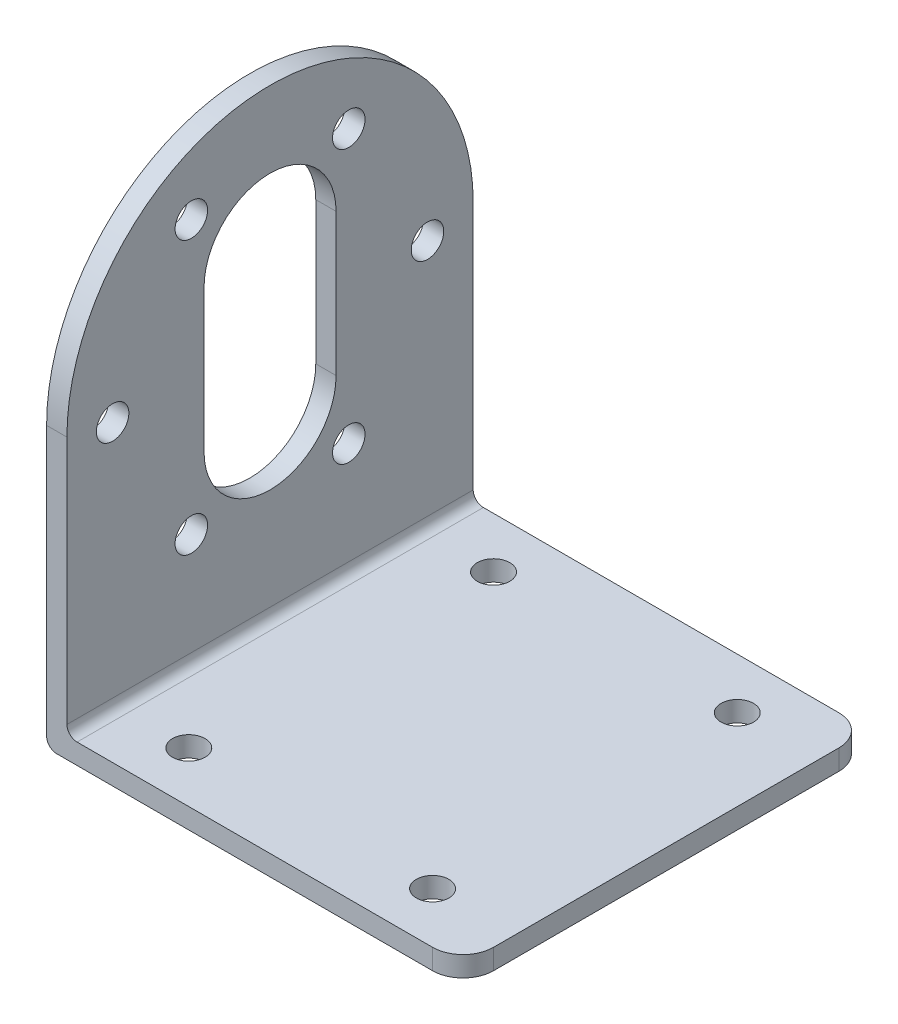
ISO-10303-21;
HEADER;
FILE_DESCRIPTION(('STEP AP214'),'2;1');
FILE_NAME('part.step','',(''),(''),'','','');
FILE_SCHEMA(('AUTOMOTIVE_DESIGN { 1 0 10303 214 1 1 1 1 }'));
ENDSEC;
DATA;
#1=APPLICATION_CONTEXT('core data for automotive mechanical design processes');
#2=APPLICATION_PROTOCOL_DEFINITION('international standard','automotive_design',2000,#1);
#3=PRODUCT_CONTEXT('',#1,'mechanical');
#4=PRODUCT('Part','Part','',(#3));
#5=PRODUCT_RELATED_PRODUCT_CATEGORY('part','',(#4));
#6=PRODUCT_DEFINITION_FORMATION('','',#4);
#7=PRODUCT_DEFINITION_CONTEXT('part definition',#1,'design');
#8=PRODUCT_DEFINITION('design','',#6,#7);
#9=PRODUCT_DEFINITION_SHAPE('','',#8);
#10=(LENGTH_UNIT() NAMED_UNIT(*) SI_UNIT(.MILLI.,.METRE.));
#11=(NAMED_UNIT(*) PLANE_ANGLE_UNIT() SI_UNIT($,.RADIAN.));
#12=(NAMED_UNIT(*) SI_UNIT($,.STERADIAN.) SOLID_ANGLE_UNIT());
#13=UNCERTAINTY_MEASURE_WITH_UNIT(LENGTH_MEASURE(1.E-05),#10,'distance_accuracy_value','');
#14=(GEOMETRIC_REPRESENTATION_CONTEXT(3) GLOBAL_UNCERTAINTY_ASSIGNED_CONTEXT((#13)) GLOBAL_UNIT_ASSIGNED_CONTEXT((#10,
#11,#12)) REPRESENTATION_CONTEXT('',''));
#15=CARTESIAN_POINT('',(0.,0.,0.));
#16=DIRECTION('',(0.,0.,1.));
#17=DIRECTION('',(1.,0.,0.));
#18=AXIS2_PLACEMENT_3D('',#15,#16,#17);
#19=CARTESIAN_POINT('',(2.,27.5,20.));
#20=DIRECTION('',(-1.,0.,0.));
#21=DIRECTION('',(0.,0.,1.));
#22=AXIS2_PLACEMENT_3D('',#19,#20,#21);
#23=CYLINDRICAL_SURFACE('',#22,20.);
#24=DIRECTION('',(-1.,0.,0.));
#25=VECTOR('',#24,1.);
#26=CARTESIAN_POINT('',(0.,27.5,40.));
#27=LINE('',#26,#25);
#28=CARTESIAN_POINT('',(2.,27.5,40.));
#29=VERTEX_POINT('',#28);
#30=CARTESIAN_POINT('',(0.,27.5,40.));
#31=VERTEX_POINT('',#30);
#32=EDGE_CURVE('E343',#29,#31,#27,.T.);
#33=ORIENTED_EDGE('',*,*,#32,.F.);
#34=CARTESIAN_POINT('',(2.,27.5,20.));
#35=DIRECTION('',(-1.,0.,0.));
#36=DIRECTION('',(0.,-1.,0.));
#37=AXIS2_PLACEMENT_3D('',#34,#35,#36);
#38=CIRCLE('',#37,20.);
#39=CARTESIAN_POINT('',(2.,27.5,0.));
#40=VERTEX_POINT('',#39);
#41=EDGE_CURVE('E106',#40,#29,#38,.F.);
#42=ORIENTED_EDGE('',*,*,#41,.F.);
#43=DIRECTION('',(1.,0.,0.));
#44=VECTOR('',#43,1.);
#45=CARTESIAN_POINT('',(2.,27.5,0.));
#46=LINE('',#45,#44);
#47=CARTESIAN_POINT('',(0.,27.5,0.));
#48=VERTEX_POINT('',#47);
#49=EDGE_CURVE('E346',#48,#40,#46,.T.);
#50=ORIENTED_EDGE('',*,*,#49,.F.);
#51=CARTESIAN_POINT('',(0.,27.5,20.));
#52=DIRECTION('',(1.,0.,0.));
#53=DIRECTION('',(0.,0.,-1.));
#54=AXIS2_PLACEMENT_3D('',#51,#52,#53);
#55=CIRCLE('',#54,20.);
#56=EDGE_CURVE('E12',#31,#48,#55,.F.);
#57=ORIENTED_EDGE('',*,*,#56,.F.);
#58=EDGE_LOOP('',(#33,#42,#50,#57));
#59=FACE_BOUND('',#58,.T.);
#60=ADVANCED_FACE('F98',(#59),#23,.T.);
#61=CARTESIAN_POINT('',(41.,0.,40.));
#62=DIRECTION('',(0.,1.,0.));
#63=DIRECTION('',(-1.,0.,0.));
#64=AXIS2_PLACEMENT_3D('',#61,#62,#63);
#65=PLANE('',#64);
#66=CARTESIAN_POINT('',(33.,0.,5.));
#67=DIRECTION('',(0.,-1.,0.));
#68=DIRECTION('',(1.,0.,0.));
#69=AXIS2_PLACEMENT_3D('',#66,#67,#68);
#70=CIRCLE('',#69,1.6);
#71=CARTESIAN_POINT('',(34.6,0.,5.));
#72=VERTEX_POINT('',#71);
#73=EDGE_CURVE('E257',#72,#72,#70,.T.);
#74=ORIENTED_EDGE('',*,*,#73,.F.);
#75=EDGE_LOOP('',(#74));
#76=FACE_BOUND('',#75,.T.);
#77=CARTESIAN_POINT('',(9.00000000000001,0.,35.));
#78=DIRECTION('',(0.,-1.,0.));
#79=DIRECTION('',(1.,0.,0.));
#80=AXIS2_PLACEMENT_3D('',#77,#78,#79);
#81=CIRCLE('',#80,1.6);
#82=CARTESIAN_POINT('',(10.6,0.,35.));
#83=VERTEX_POINT('',#82);
#84=EDGE_CURVE('E256',#83,#83,#81,.T.);
#85=ORIENTED_EDGE('',*,*,#84,.F.);
#86=EDGE_LOOP('',(#85));
#87=FACE_BOUND('',#86,.T.);
#88=CARTESIAN_POINT('',(9.00000000000001,0.,5.));
#89=DIRECTION('',(0.,-1.,0.));
#90=DIRECTION('',(1.,0.,0.));
#91=AXIS2_PLACEMENT_3D('',#88,#89,#90);
#92=CIRCLE('',#91,1.6);
#93=CARTESIAN_POINT('',(10.6,0.,5.));
#94=VERTEX_POINT('',#93);
#95=EDGE_CURVE('E253',#94,#94,#92,.T.);
#96=ORIENTED_EDGE('',*,*,#95,.F.);
#97=EDGE_LOOP('',(#96));
#98=FACE_BOUND('',#97,.T.);
#99=CARTESIAN_POINT('',(33.,0.,35.));
#100=DIRECTION('',(0.,-1.,0.));
#101=DIRECTION('',(1.,0.,0.));
#102=AXIS2_PLACEMENT_3D('',#99,#100,#101);
#103=CIRCLE('',#102,1.6);
#104=CARTESIAN_POINT('',(34.6,0.,35.));
#105=VERTEX_POINT('',#104);
#106=EDGE_CURVE('E260',#105,#105,#103,.T.);
#107=ORIENTED_EDGE('',*,*,#106,.F.);
#108=EDGE_LOOP('',(#107));
#109=FACE_BOUND('',#108,.T.);
#110=DIRECTION('',(1.,0.,0.));
#111=VECTOR('',#110,1.);
#112=CARTESIAN_POINT('',(41.,0.,0.));
#113=LINE('',#112,#111);
#114=CARTESIAN_POINT('',(1.00000000000001,0.,0.));
#115=VERTEX_POINT('',#114);
#116=CARTESIAN_POINT('',(38.,0.,0.));
#117=VERTEX_POINT('',#116);
#118=EDGE_CURVE('E278',#115,#117,#113,.T.);
#119=ORIENTED_EDGE('',*,*,#118,.T.);
#120=CARTESIAN_POINT('',(38.,0.,3.));
#121=DIRECTION('',(0.,1.,0.));
#122=DIRECTION('',(-1.,0.,0.));
#123=AXIS2_PLACEMENT_3D('',#120,#121,#122);
#124=CIRCLE('',#123,3.);
#125=CARTESIAN_POINT('',(41.,0.,3.));
#126=VERTEX_POINT('',#125);
#127=EDGE_CURVE('E338',#117,#126,#124,.F.);
#128=ORIENTED_EDGE('',*,*,#127,.T.);
#129=DIRECTION('',(0.,0.,-1.));
#130=VECTOR('',#129,1.);
#131=CARTESIAN_POINT('',(41.,0.,40.));
#132=LINE('',#131,#130);
#133=CARTESIAN_POINT('',(41.,0.,37.));
#134=VERTEX_POINT('',#133);
#135=EDGE_CURVE('E290',#134,#126,#132,.T.);
#136=ORIENTED_EDGE('',*,*,#135,.F.);
#137=CARTESIAN_POINT('',(38.,0.,37.));
#138=DIRECTION('',(0.,1.,0.));
#139=DIRECTION('',(-1.,0.,0.));
#140=AXIS2_PLACEMENT_3D('',#137,#138,#139);
#141=CIRCLE('',#140,3.);
#142=CARTESIAN_POINT('',(38.,0.,40.));
#143=VERTEX_POINT('',#142);
#144=EDGE_CURVE('E336',#134,#143,#141,.F.);
#145=ORIENTED_EDGE('',*,*,#144,.T.);
#146=DIRECTION('',(1.,0.,0.));
#147=VECTOR('',#146,1.);
#148=CARTESIAN_POINT('',(41.,0.,40.));
#149=LINE('',#148,#147);
#150=CARTESIAN_POINT('',(1.00000000000001,0.,40.));
#151=VERTEX_POINT('',#150);
#152=EDGE_CURVE('E266',#151,#143,#149,.T.);
#153=ORIENTED_EDGE('',*,*,#152,.F.);
#154=DIRECTION('',(0.,0.,-1.));
#155=VECTOR('',#154,1.);
#156=CARTESIAN_POINT('',(1.,0.,40.));
#157=LINE('',#156,#155);
#158=EDGE_CURVE('E293',#151,#115,#157,.T.);
#159=ORIENTED_EDGE('',*,*,#158,.T.);
#160=EDGE_LOOP('',(#119,#128,#136,#145,#153,#159));
#161=FACE_BOUND('',#160,.T.);
#162=ADVANCED_FACE('F376',(#76,#87,#98,#109,#161),#65,.F.);
#163=CARTESIAN_POINT('',(41.,2.,40.));
#164=DIRECTION('',(-1.,0.,0.));
#165=DIRECTION('',(0.,0.,1.));
#166=AXIS2_PLACEMENT_3D('',#163,#164,#165);
#167=PLANE('',#166);
#168=ORIENTED_EDGE('',*,*,#135,.T.);
#169=DIRECTION('',(0.,1.,0.));
#170=VECTOR('',#169,1.);
#171=CARTESIAN_POINT('',(41.,2.,3.));
#172=LINE('',#171,#170);
#173=CARTESIAN_POINT('',(41.,2.,3.));
#174=VERTEX_POINT('',#173);
#175=EDGE_CURVE('E327',#126,#174,#172,.T.);
#176=ORIENTED_EDGE('',*,*,#175,.T.);
#177=DIRECTION('',(0.,0.,-1.));
#178=VECTOR('',#177,1.);
#179=CARTESIAN_POINT('',(41.,2.,40.));
#180=LINE('',#179,#178);
#181=CARTESIAN_POINT('',(41.,2.,37.));
#182=VERTEX_POINT('',#181);
#183=EDGE_CURVE('E277',#182,#174,#180,.T.);
#184=ORIENTED_EDGE('',*,*,#183,.F.);
#185=DIRECTION('',(0.,1.,0.));
#186=VECTOR('',#185,1.);
#187=CARTESIAN_POINT('',(41.,2.,37.));
#188=LINE('',#187,#186);
#189=EDGE_CURVE('E315',#182,#134,#188,.F.);
#190=ORIENTED_EDGE('',*,*,#189,.T.);
#191=EDGE_LOOP('',(#168,#176,#184,#190));
#192=FACE_BOUND('',#191,.T.);
#193=ADVANCED_FACE('F394',(#192),#167,.F.);
#194=CARTESIAN_POINT('',(2.00000000000001,2.,40.));
#195=DIRECTION('',(0.,-1.,0.));
#196=DIRECTION('',(1.,0.,0.));
#197=AXIS2_PLACEMENT_3D('',#194,#195,#196);
#198=PLANE('',#197);
#199=CARTESIAN_POINT('',(33.,2.,5.));
#200=DIRECTION('',(0.,-1.,0.));
#201=DIRECTION('',(1.,0.,0.));
#202=AXIS2_PLACEMENT_3D('',#199,#200,#201);
#203=CIRCLE('',#202,1.6);
#204=CARTESIAN_POINT('',(34.6,2.,5.));
#205=VERTEX_POINT('',#204);
#206=EDGE_CURVE('E282',#205,#205,#203,.T.);
#207=ORIENTED_EDGE('',*,*,#206,.T.);
#208=EDGE_LOOP('',(#207));
#209=FACE_BOUND('',#208,.T.);
#210=CARTESIAN_POINT('',(9.00000000000001,2.,35.));
#211=DIRECTION('',(0.,-1.,0.));
#212=DIRECTION('',(1.,0.,0.));
#213=AXIS2_PLACEMENT_3D('',#210,#211,#212);
#214=CIRCLE('',#213,1.6);
#215=CARTESIAN_POINT('',(10.6,2.,35.));
#216=VERTEX_POINT('',#215);
#217=EDGE_CURVE('E321',#216,#216,#214,.T.);
#218=ORIENTED_EDGE('',*,*,#217,.T.);
#219=EDGE_LOOP('',(#218));
#220=FACE_BOUND('',#219,.T.);
#221=CARTESIAN_POINT('',(9.00000000000001,2.,5.));
#222=DIRECTION('',(0.,-1.,0.));
#223=DIRECTION('',(1.,0.,0.));
#224=AXIS2_PLACEMENT_3D('',#221,#222,#223);
#225=CIRCLE('',#224,1.6);
#226=CARTESIAN_POINT('',(10.6,2.,5.));
#227=VERTEX_POINT('',#226);
#228=EDGE_CURVE('E318',#227,#227,#225,.T.);
#229=ORIENTED_EDGE('',*,*,#228,.T.);
#230=EDGE_LOOP('',(#229));
#231=FACE_BOUND('',#230,.T.);
#232=CARTESIAN_POINT('',(33.,2.,35.));
#233=DIRECTION('',(0.,-1.,0.));
#234=DIRECTION('',(1.,0.,0.));
#235=AXIS2_PLACEMENT_3D('',#232,#233,#234);
#236=CIRCLE('',#235,1.6);
#237=CARTESIAN_POINT('',(34.6,2.,35.));
#238=VERTEX_POINT('',#237);
#239=EDGE_CURVE('E265',#238,#238,#236,.T.);
#240=ORIENTED_EDGE('',*,*,#239,.T.);
#241=EDGE_LOOP('',(#240));
#242=FACE_BOUND('',#241,.T.);
#243=ORIENTED_EDGE('',*,*,#183,.T.);
#244=CARTESIAN_POINT('',(38.,2.,3.));
#245=DIRECTION('',(0.,-1.,0.));
#246=DIRECTION('',(1.,0.,0.));
#247=AXIS2_PLACEMENT_3D('',#244,#245,#246);
#248=CIRCLE('',#247,3.);
#249=CARTESIAN_POINT('',(38.,2.,0.));
#250=VERTEX_POINT('',#249);
#251=EDGE_CURVE('E332',#174,#250,#248,.F.);
#252=ORIENTED_EDGE('',*,*,#251,.T.);
#253=DIRECTION('',(-1.,0.,0.));
#254=VECTOR('',#253,1.);
#255=CARTESIAN_POINT('',(2.00000000000001,2.,0.));
#256=LINE('',#255,#254);
#257=CARTESIAN_POINT('',(3.00000000000001,2.,0.));
#258=VERTEX_POINT('',#257);
#259=EDGE_CURVE('E281',#250,#258,#256,.T.);
#260=ORIENTED_EDGE('',*,*,#259,.T.);
#261=DIRECTION('',(0.,0.,-1.));
#262=VECTOR('',#261,1.);
#263=CARTESIAN_POINT('',(3.00000000000001,2.,40.));
#264=LINE('',#263,#262);
#265=CARTESIAN_POINT('',(3.00000000000001,2.,40.));
#266=VERTEX_POINT('',#265);
#267=EDGE_CURVE('E307',#258,#266,#264,.F.);
#268=ORIENTED_EDGE('',*,*,#267,.T.);
#269=DIRECTION('',(-1.,0.,0.));
#270=VECTOR('',#269,1.);
#271=CARTESIAN_POINT('',(2.00000000000001,2.,40.));
#272=LINE('',#271,#270);
#273=CARTESIAN_POINT('',(38.,2.,40.));
#274=VERTEX_POINT('',#273);
#275=EDGE_CURVE('E269',#274,#266,#272,.T.);
#276=ORIENTED_EDGE('',*,*,#275,.F.);
#277=CARTESIAN_POINT('',(38.,2.,37.));
#278=DIRECTION('',(0.,-1.,0.));
#279=DIRECTION('',(1.,0.,0.));
#280=AXIS2_PLACEMENT_3D('',#277,#278,#279);
#281=CIRCLE('',#280,3.);
#282=EDGE_CURVE('E330',#274,#182,#281,.F.);
#283=ORIENTED_EDGE('',*,*,#282,.T.);
#284=EDGE_LOOP('',(#243,#252,#260,#268,#276,#283));
#285=FACE_BOUND('',#284,.T.);
#286=ADVANCED_FACE('F399',(#209,#220,#231,#242,#285),#198,.F.);
#287=CARTESIAN_POINT('',(2.,47.5,40.));
#288=DIRECTION('',(-1.,0.,0.));
#289=DIRECTION('',(0.,-1.,0.));
#290=AXIS2_PLACEMENT_3D('',#287,#288,#289);
#291=PLANE('',#290);
#292=CARTESIAN_POINT('',(2.00000000000001,13.0766062413412,27.75));
#293=DIRECTION('',(-1.,0.,0.));
#294=DIRECTION('',(0.,-1.,0.));
#295=AXIS2_PLACEMENT_3D('',#292,#293,#294);
#296=CIRCLE('',#295,1.6);
#297=CARTESIAN_POINT('',(2.00000000000001,11.4766062413412,27.75));
#298=VERTEX_POINT('',#297);
#299=EDGE_CURVE('E250',#298,#298,#296,.T.);
#300=ORIENTED_EDGE('',*,*,#299,.T.);
#301=EDGE_LOOP('',(#300));
#302=FACE_BOUND('',#301,.T.);
#303=CARTESIAN_POINT('',(2.00000000000001,13.0766062413412,12.2499999999999));
#304=DIRECTION('',(-1.,0.,0.));
#305=DIRECTION('',(0.,-1.,0.));
#306=AXIS2_PLACEMENT_3D('',#303,#304,#305);
#307=CIRCLE('',#306,1.6);
#308=CARTESIAN_POINT('',(2.00000000000001,11.4766062413412,12.2499999999999));
#309=VERTEX_POINT('',#308);
#310=EDGE_CURVE('E247',#309,#309,#307,.T.);
#311=ORIENTED_EDGE('',*,*,#310,.T.);
#312=EDGE_LOOP('',(#311));
#313=FACE_BOUND('',#312,.T.);
#314=CARTESIAN_POINT('',(2.,26.5000000000001,4.5));
#315=DIRECTION('',(-1.,0.,0.));
#316=DIRECTION('',(0.,-1.,0.));
#317=AXIS2_PLACEMENT_3D('',#314,#315,#316);
#318=CIRCLE('',#317,1.59999999999999);
#319=CARTESIAN_POINT('',(2.,24.9000000000001,4.5));
#320=VERTEX_POINT('',#319);
#321=EDGE_CURVE('E244',#320,#320,#318,.T.);
#322=ORIENTED_EDGE('',*,*,#321,.T.);
#323=EDGE_LOOP('',(#322));
#324=FACE_BOUND('',#323,.T.);
#325=CARTESIAN_POINT('',(2.,39.9233937586589,12.2500000000001));
#326=DIRECTION('',(-1.,0.,0.));
#327=DIRECTION('',(0.,-1.,0.));
#328=AXIS2_PLACEMENT_3D('',#325,#326,#327);
#329=CIRCLE('',#328,1.6);
#330=CARTESIAN_POINT('',(2.,38.3233937586589,12.2500000000001));
#331=VERTEX_POINT('',#330);
#332=EDGE_CURVE('E241',#331,#331,#329,.T.);
#333=ORIENTED_EDGE('',*,*,#332,.T.);
#334=EDGE_LOOP('',(#333));
#335=FACE_BOUND('',#334,.T.);
#336=CARTESIAN_POINT('',(2.,39.9233937586587,27.7500000000002));
#337=DIRECTION('',(-1.,0.,0.));
#338=DIRECTION('',(0.,-1.,0.));
#339=AXIS2_PLACEMENT_3D('',#336,#337,#338);
#340=CIRCLE('',#339,1.6);
#341=CARTESIAN_POINT('',(2.,38.3233937586587,27.7500000000002));
#342=VERTEX_POINT('',#341);
#343=EDGE_CURVE('E238',#342,#342,#340,.T.);
#344=ORIENTED_EDGE('',*,*,#343,.T.);
#345=EDGE_LOOP('',(#344));
#346=FACE_BOUND('',#345,.T.);
#347=CARTESIAN_POINT('',(2.,26.5,35.5));
#348=DIRECTION('',(-1.,0.,0.));
#349=DIRECTION('',(0.,-1.,0.));
#350=AXIS2_PLACEMENT_3D('',#347,#348,#349);
#351=CIRCLE('',#350,1.6);
#352=CARTESIAN_POINT('',(2.,24.9,35.5));
#353=VERTEX_POINT('',#352);
#354=EDGE_CURVE('E235',#353,#353,#351,.T.);
#355=ORIENTED_EDGE('',*,*,#354,.T.);
#356=EDGE_LOOP('',(#355));
#357=FACE_BOUND('',#356,.T.);
#358=CARTESIAN_POINT('',(2.00000000000001,19.5,20.));
#359=DIRECTION('',(-1.,0.,0.));
#360=DIRECTION('',(0.,-1.,0.));
#361=AXIS2_PLACEMENT_3D('',#358,#359,#360);
#362=CIRCLE('',#361,6.5);
#363=CARTESIAN_POINT('',(2.,19.5,13.5));
#364=VERTEX_POINT('',#363);
#365=CARTESIAN_POINT('',(2.00000000000001,19.5,26.5));
#366=VERTEX_POINT('',#365);
#367=EDGE_CURVE('E229',#364,#366,#362,.T.);
#368=ORIENTED_EDGE('',*,*,#367,.T.);
#369=DIRECTION('',(0.,1.,0.));
#370=VECTOR('',#369,1.);
#371=CARTESIAN_POINT('',(2.,47.5,26.5));
#372=LINE('',#371,#370);
#373=CARTESIAN_POINT('',(2.,33.5,26.5));
#374=VERTEX_POINT('',#373);
#375=EDGE_CURVE('E232',#366,#374,#372,.T.);
#376=ORIENTED_EDGE('',*,*,#375,.T.);
#377=CARTESIAN_POINT('',(2.,33.5,20.));
#378=DIRECTION('',(-1.,0.,0.));
#379=DIRECTION('',(0.,-1.,0.));
#380=AXIS2_PLACEMENT_3D('',#377,#378,#379);
#381=CIRCLE('',#380,6.5);
#382=CARTESIAN_POINT('',(2.,33.5,13.5));
#383=VERTEX_POINT('',#382);
#384=EDGE_CURVE('E224',#374,#383,#381,.T.);
#385=ORIENTED_EDGE('',*,*,#384,.T.);
#386=DIRECTION('',(0.,1.,0.));
#387=VECTOR('',#386,1.);
#388=CARTESIAN_POINT('',(2.,47.5,13.5));
#389=LINE('',#388,#387);
#390=EDGE_CURVE('E204',#364,#383,#389,.T.);
#391=ORIENTED_EDGE('',*,*,#390,.F.);
#392=EDGE_LOOP('',(#368,#376,#385,#391));
#393=FACE_BOUND('',#392,.T.);
#394=DIRECTION('',(0.,1.,0.));
#395=VECTOR('',#394,1.);
#396=CARTESIAN_POINT('',(2.,47.5,0.));
#397=LINE('',#396,#395);
#398=CARTESIAN_POINT('',(2.00000000000001,3.,0.));
#399=VERTEX_POINT('',#398);
#400=EDGE_CURVE('E284',#399,#40,#397,.T.);
#401=ORIENTED_EDGE('',*,*,#400,.T.);
#402=ORIENTED_EDGE('',*,*,#41,.T.);
#403=DIRECTION('',(0.,1.,0.));
#404=VECTOR('',#403,1.);
#405=CARTESIAN_POINT('',(2.,47.5,40.));
#406=LINE('',#405,#404);
#407=CARTESIAN_POINT('',(2.00000000000001,3.,40.));
#408=VERTEX_POINT('',#407);
#409=EDGE_CURVE('E272',#408,#29,#406,.T.);
#410=ORIENTED_EDGE('',*,*,#409,.F.);
#411=DIRECTION('',(0.,0.,-1.));
#412=VECTOR('',#411,1.);
#413=CARTESIAN_POINT('',(2.00000000000001,3.,0.));
#414=LINE('',#413,#412);
#415=EDGE_CURVE('E304',#408,#399,#414,.T.);
#416=ORIENTED_EDGE('',*,*,#415,.T.);
#417=EDGE_LOOP('',(#401,#402,#410,#416));
#418=FACE_BOUND('',#417,.T.);
#419=ADVANCED_FACE('F351',(#302,#313,#324,#335,#346,#357,#393,#418),#291,.F.);
#420=CARTESIAN_POINT('',(0.,0.,40.));
#421=DIRECTION('',(1.,0.,0.));
#422=DIRECTION('',(0.,0.,-1.));
#423=AXIS2_PLACEMENT_3D('',#420,#421,#422);
#424=PLANE('',#423);
#425=CARTESIAN_POINT('',(0.,13.0766062413412,27.75));
#426=DIRECTION('',(-1.,0.,0.));
#427=DIRECTION('',(0.,0.,1.));
#428=AXIS2_PLACEMENT_3D('',#425,#426,#427);
#429=CIRCLE('',#428,1.6);
#430=CARTESIAN_POINT('',(0.,13.0766062413412,29.35));
#431=VERTEX_POINT('',#430);
#432=EDGE_CURVE('E480',#431,#431,#429,.T.);
#433=ORIENTED_EDGE('',*,*,#432,.F.);
#434=EDGE_LOOP('',(#433));
#435=FACE_BOUND('',#434,.T.);
#436=CARTESIAN_POINT('',(0.,13.0766062413412,12.2499999999999));
#437=DIRECTION('',(-1.,0.,0.));
#438=DIRECTION('',(0.,0.,1.));
#439=AXIS2_PLACEMENT_3D('',#436,#437,#438);
#440=CIRCLE('',#439,1.6);
#441=CARTESIAN_POINT('',(0.,13.0766062413412,13.8499999999999));
#442=VERTEX_POINT('',#441);
#443=EDGE_CURVE('E483',#442,#442,#440,.T.);
#444=ORIENTED_EDGE('',*,*,#443,.F.);
#445=EDGE_LOOP('',(#444));
#446=FACE_BOUND('',#445,.T.);
#447=CARTESIAN_POINT('',(0.,26.5000000000001,4.5));
#448=DIRECTION('',(-1.,0.,0.));
#449=DIRECTION('',(0.,0.,1.));
#450=AXIS2_PLACEMENT_3D('',#447,#448,#449);
#451=CIRCLE('',#450,1.59999999999999);
#452=CARTESIAN_POINT('',(0.,26.5000000000001,6.09999999999999));
#453=VERTEX_POINT('',#452);
#454=EDGE_CURVE('E486',#453,#453,#451,.T.);
#455=ORIENTED_EDGE('',*,*,#454,.F.);
#456=EDGE_LOOP('',(#455));
#457=FACE_BOUND('',#456,.T.);
#458=CARTESIAN_POINT('',(0.,39.9233937586589,12.2500000000001));
#459=DIRECTION('',(-1.,0.,0.));
#460=DIRECTION('',(0.,0.,1.));
#461=AXIS2_PLACEMENT_3D('',#458,#459,#460);
#462=CIRCLE('',#461,1.6);
#463=CARTESIAN_POINT('',(0.,39.9233937586589,13.8500000000001));
#464=VERTEX_POINT('',#463);
#465=EDGE_CURVE('E489',#464,#464,#462,.T.);
#466=ORIENTED_EDGE('',*,*,#465,.F.);
#467=EDGE_LOOP('',(#466));
#468=FACE_BOUND('',#467,.T.);
#469=CARTESIAN_POINT('',(0.,39.9233937586587,27.7500000000002));
#470=DIRECTION('',(-1.,0.,0.));
#471=DIRECTION('',(0.,0.,1.));
#472=AXIS2_PLACEMENT_3D('',#469,#470,#471);
#473=CIRCLE('',#472,1.6);
#474=CARTESIAN_POINT('',(0.,39.9233937586587,29.3500000000002));
#475=VERTEX_POINT('',#474);
#476=EDGE_CURVE('E477',#475,#475,#473,.T.);
#477=ORIENTED_EDGE('',*,*,#476,.F.);
#478=EDGE_LOOP('',(#477));
#479=FACE_BOUND('',#478,.T.);
#480=CARTESIAN_POINT('',(0.,26.5,35.5));
#481=DIRECTION('',(-1.,0.,0.));
#482=DIRECTION('',(0.,0.,1.));
#483=AXIS2_PLACEMENT_3D('',#480,#481,#482);
#484=CIRCLE('',#483,1.6);
#485=CARTESIAN_POINT('',(0.,26.5,37.1));
#486=VERTEX_POINT('',#485);
#487=EDGE_CURVE('E472',#486,#486,#484,.T.);
#488=ORIENTED_EDGE('',*,*,#487,.F.);
#489=EDGE_LOOP('',(#488));
#490=FACE_BOUND('',#489,.T.);
#491=CARTESIAN_POINT('',(0.,33.5,20.));
#492=DIRECTION('',(-1.,0.,0.));
#493=DIRECTION('',(0.,0.,1.));
#494=AXIS2_PLACEMENT_3D('',#491,#492,#493);
#495=CIRCLE('',#494,6.5);
#496=CARTESIAN_POINT('',(0.,33.5,26.5));
#497=VERTEX_POINT('',#496);
#498=CARTESIAN_POINT('',(0.,33.5,13.5));
#499=VERTEX_POINT('',#498);
#500=EDGE_CURVE('E210',#497,#499,#495,.T.);
#501=ORIENTED_EDGE('',*,*,#500,.F.);
#502=DIRECTION('',(0.,1.,0.));
#503=VECTOR('',#502,1.);
#504=CARTESIAN_POINT('',(0.,0.,26.5));
#505=LINE('',#504,#503);
#506=CARTESIAN_POINT('',(0.,19.5,26.5));
#507=VERTEX_POINT('',#506);
#508=EDGE_CURVE('E121',#507,#497,#505,.T.);
#509=ORIENTED_EDGE('',*,*,#508,.F.);
#510=CARTESIAN_POINT('',(0.,19.5,20.));
#511=DIRECTION('',(-1.,0.,0.));
#512=DIRECTION('',(0.,0.,1.));
#513=AXIS2_PLACEMENT_3D('',#510,#511,#512);
#514=CIRCLE('',#513,6.5);
#515=CARTESIAN_POINT('',(0.,19.5,13.5));
#516=VERTEX_POINT('',#515);
#517=EDGE_CURVE('E217',#516,#507,#514,.T.);
#518=ORIENTED_EDGE('',*,*,#517,.F.);
#519=DIRECTION('',(0.,1.,0.));
#520=VECTOR('',#519,1.);
#521=CARTESIAN_POINT('',(0.,0.,13.5));
#522=LINE('',#521,#520);
#523=EDGE_CURVE('E201',#516,#499,#522,.T.);
#524=ORIENTED_EDGE('',*,*,#523,.T.);
#525=EDGE_LOOP('',(#501,#509,#518,#524));
#526=FACE_BOUND('',#525,.T.);
#527=DIRECTION('',(0.,-1.,0.));
#528=VECTOR('',#527,1.);
#529=CARTESIAN_POINT('',(0.,0.,40.));
#530=LINE('',#529,#528);
#531=CARTESIAN_POINT('',(0.,1.,40.));
#532=VERTEX_POINT('',#531);
#533=EDGE_CURVE('E275',#31,#532,#530,.T.);
#534=ORIENTED_EDGE('',*,*,#533,.F.);
#535=ORIENTED_EDGE('',*,*,#56,.T.);
#536=DIRECTION('',(0.,-1.,0.));
#537=VECTOR('',#536,1.);
#538=CARTESIAN_POINT('',(0.,0.,0.));
#539=LINE('',#538,#537);
#540=CARTESIAN_POINT('',(0.,1.,0.));
#541=VERTEX_POINT('',#540);
#542=EDGE_CURVE('E270',#48,#541,#539,.T.);
#543=ORIENTED_EDGE('',*,*,#542,.T.);
#544=DIRECTION('',(0.,0.,-1.));
#545=VECTOR('',#544,1.);
#546=CARTESIAN_POINT('',(0.,1.,40.));
#547=LINE('',#546,#545);
#548=EDGE_CURVE('E299',#541,#532,#547,.F.);
#549=ORIENTED_EDGE('',*,*,#548,.T.);
#550=EDGE_LOOP('',(#534,#535,#543,#549));
#551=FACE_BOUND('',#550,.T.);
#552=ADVANCED_FACE('F214',(#435,#446,#457,#468,#479,#490,#526,#551),#424,.F.);
#553=CARTESIAN_POINT('',(0.,0.,40.));
#554=DIRECTION('',(0.,0.,-1.));
#555=DIRECTION('',(-1.,0.,0.));
#556=AXIS2_PLACEMENT_3D('',#553,#554,#555);
#557=PLANE('',#556);
#558=ORIENTED_EDGE('',*,*,#409,.T.);
#559=ORIENTED_EDGE('',*,*,#32,.T.);
#560=ORIENTED_EDGE('',*,*,#533,.T.);
#561=CARTESIAN_POINT('',(1.,1.,40.));
#562=DIRECTION('',(0.,0.,-1.));
#563=DIRECTION('',(-1.,0.,0.));
#564=AXIS2_PLACEMENT_3D('',#561,#562,#563);
#565=CIRCLE('',#564,1.);
#566=EDGE_CURVE('E302',#532,#151,#565,.F.);
#567=ORIENTED_EDGE('',*,*,#566,.T.);
#568=ORIENTED_EDGE('',*,*,#152,.T.);
#569=DIRECTION('',(0.,1.,0.));
#570=VECTOR('',#569,1.);
#571=CARTESIAN_POINT('',(38.,0.,40.));
#572=LINE('',#571,#570);
#573=EDGE_CURVE('E340',#143,#274,#572,.T.);
#574=ORIENTED_EDGE('',*,*,#573,.T.);
#575=ORIENTED_EDGE('',*,*,#275,.T.);
#576=CARTESIAN_POINT('',(3.00000000000001,3.,40.));
#577=DIRECTION('',(0.,0.,-1.));
#578=DIRECTION('',(-1.,0.,0.));
#579=AXIS2_PLACEMENT_3D('',#576,#577,#578);
#580=CIRCLE('',#579,1.);
#581=EDGE_CURVE('E313',#266,#408,#580,.T.);
#582=ORIENTED_EDGE('',*,*,#581,.T.);
#583=EDGE_LOOP('',(#558,#559,#560,#567,#568,#574,#575,#582));
#584=FACE_BOUND('',#583,.T.);
#585=ADVANCED_FACE('F358',(#584),#557,.F.);
#586=CARTESIAN_POINT('',(0.,0.,0.));
#587=DIRECTION('',(0.,0.,-1.));
#588=DIRECTION('',(-1.,0.,0.));
#589=AXIS2_PLACEMENT_3D('',#586,#587,#588);
#590=PLANE('',#589);
#591=ORIENTED_EDGE('',*,*,#542,.F.);
#592=ORIENTED_EDGE('',*,*,#49,.T.);
#593=ORIENTED_EDGE('',*,*,#400,.F.);
#594=CARTESIAN_POINT('',(3.00000000000001,3.,0.));
#595=DIRECTION('',(0.,0.,-1.));
#596=DIRECTION('',(-1.,0.,0.));
#597=AXIS2_PLACEMENT_3D('',#594,#595,#596);
#598=CIRCLE('',#597,1.);
#599=EDGE_CURVE('E310',#399,#258,#598,.F.);
#600=ORIENTED_EDGE('',*,*,#599,.T.);
#601=ORIENTED_EDGE('',*,*,#259,.F.);
#602=DIRECTION('',(0.,1.,0.));
#603=VECTOR('',#602,1.);
#604=CARTESIAN_POINT('',(38.,0.,0.));
#605=LINE('',#604,#603);
#606=EDGE_CURVE('E334',#250,#117,#605,.F.);
#607=ORIENTED_EDGE('',*,*,#606,.T.);
#608=ORIENTED_EDGE('',*,*,#118,.F.);
#609=CARTESIAN_POINT('',(1.,1.,0.));
#610=DIRECTION('',(0.,0.,-1.));
#611=DIRECTION('',(-1.,0.,0.));
#612=AXIS2_PLACEMENT_3D('',#609,#610,#611);
#613=CIRCLE('',#612,1.);
#614=EDGE_CURVE('E296',#115,#541,#613,.T.);
#615=ORIENTED_EDGE('',*,*,#614,.T.);
#616=EDGE_LOOP('',(#591,#592,#593,#600,#601,#607,#608,#615));
#617=FACE_BOUND('',#616,.T.);
#618=ADVANCED_FACE('F366',(#617),#590,.T.);
#619=CARTESIAN_POINT('',(1.,1.,40.));
#620=DIRECTION('',(0.,0.,-1.));
#621=DIRECTION('',(-1.,0.,0.));
#622=AXIS2_PLACEMENT_3D('',#619,#620,#621);
#623=CYLINDRICAL_SURFACE('',#622,1.);
#624=ORIENTED_EDGE('',*,*,#566,.F.);
#625=ORIENTED_EDGE('',*,*,#548,.F.);
#626=ORIENTED_EDGE('',*,*,#614,.F.);
#627=ORIENTED_EDGE('',*,*,#158,.F.);
#628=EDGE_LOOP('',(#624,#625,#626,#627));
#629=FACE_BOUND('',#628,.T.);
#630=ADVANCED_FACE('F379',(#629),#623,.T.);
#631=CARTESIAN_POINT('',(3.00000000000001,3.,40.));
#632=DIRECTION('',(0.,0.,1.));
#633=DIRECTION('',(1.,0.,0.));
#634=AXIS2_PLACEMENT_3D('',#631,#632,#633);
#635=CYLINDRICAL_SURFACE('',#634,1.);
#636=ORIENTED_EDGE('',*,*,#581,.F.);
#637=ORIENTED_EDGE('',*,*,#267,.F.);
#638=ORIENTED_EDGE('',*,*,#599,.F.);
#639=ORIENTED_EDGE('',*,*,#415,.F.);
#640=EDGE_LOOP('',(#636,#637,#638,#639));
#641=FACE_BOUND('',#640,.T.);
#642=ADVANCED_FACE('F363',(#641),#635,.F.);
#643=CARTESIAN_POINT('',(33.,40.,35.));
#644=DIRECTION('',(0.,-1.,0.));
#645=DIRECTION('',(1.,0.,0.));
#646=AXIS2_PLACEMENT_3D('',#643,#644,#645);
#647=CYLINDRICAL_SURFACE('',#646,1.6);
#648=ORIENTED_EDGE('',*,*,#106,.T.);
#649=EDGE_LOOP('',(#648));
#650=FACE_BOUND('',#649,.T.);
#651=ORIENTED_EDGE('',*,*,#239,.F.);
#652=EDGE_LOOP('',(#651));
#653=FACE_BOUND('',#652,.T.);
#654=ADVANCED_FACE('F386',(#650,#653),#647,.F.);
#655=CARTESIAN_POINT('',(9.00000000000001,40.,5.));
#656=DIRECTION('',(0.,-1.,0.));
#657=DIRECTION('',(1.,0.,0.));
#658=AXIS2_PLACEMENT_3D('',#655,#656,#657);
#659=CYLINDRICAL_SURFACE('',#658,1.6);
#660=ORIENTED_EDGE('',*,*,#95,.T.);
#661=EDGE_LOOP('',(#660));
#662=FACE_BOUND('',#661,.T.);
#663=ORIENTED_EDGE('',*,*,#228,.F.);
#664=EDGE_LOOP('',(#663));
#665=FACE_BOUND('',#664,.T.);
#666=ADVANCED_FACE('F418',(#662,#665),#659,.F.);
#667=CARTESIAN_POINT('',(9.00000000000001,40.,35.));
#668=DIRECTION('',(0.,-1.,0.));
#669=DIRECTION('',(1.,0.,0.));
#670=AXIS2_PLACEMENT_3D('',#667,#668,#669);
#671=CYLINDRICAL_SURFACE('',#670,1.6);
#672=ORIENTED_EDGE('',*,*,#84,.T.);
#673=EDGE_LOOP('',(#672));
#674=FACE_BOUND('',#673,.T.);
#675=ORIENTED_EDGE('',*,*,#217,.F.);
#676=EDGE_LOOP('',(#675));
#677=FACE_BOUND('',#676,.T.);
#678=ADVANCED_FACE('F420',(#674,#677),#671,.F.);
#679=CARTESIAN_POINT('',(33.,40.,5.));
#680=DIRECTION('',(0.,-1.,0.));
#681=DIRECTION('',(1.,0.,0.));
#682=AXIS2_PLACEMENT_3D('',#679,#680,#681);
#683=CYLINDRICAL_SURFACE('',#682,1.6);
#684=ORIENTED_EDGE('',*,*,#73,.T.);
#685=EDGE_LOOP('',(#684));
#686=FACE_BOUND('',#685,.T.);
#687=ORIENTED_EDGE('',*,*,#206,.F.);
#688=EDGE_LOOP('',(#687));
#689=FACE_BOUND('',#688,.T.);
#690=ADVANCED_FACE('F423',(#686,#689),#683,.F.);
#691=CARTESIAN_POINT('',(38.,2.,3.));
#692=DIRECTION('',(0.,-1.,0.));
#693=DIRECTION('',(0.,0.,-1.));
#694=AXIS2_PLACEMENT_3D('',#691,#692,#693);
#695=CYLINDRICAL_SURFACE('',#694,3.);
#696=ORIENTED_EDGE('',*,*,#127,.F.);
#697=ORIENTED_EDGE('',*,*,#606,.F.);
#698=ORIENTED_EDGE('',*,*,#251,.F.);
#699=ORIENTED_EDGE('',*,*,#175,.F.);
#700=EDGE_LOOP('',(#696,#697,#698,#699));
#701=FACE_BOUND('',#700,.T.);
#702=ADVANCED_FACE('F427',(#701),#695,.T.);
#703=CARTESIAN_POINT('',(38.,0.,37.));
#704=DIRECTION('',(0.,1.,0.));
#705=DIRECTION('',(0.,0.,1.));
#706=AXIS2_PLACEMENT_3D('',#703,#704,#705);
#707=CYLINDRICAL_SURFACE('',#706,3.);
#708=ORIENTED_EDGE('',*,*,#144,.F.);
#709=ORIENTED_EDGE('',*,*,#189,.F.);
#710=ORIENTED_EDGE('',*,*,#282,.F.);
#711=ORIENTED_EDGE('',*,*,#573,.F.);
#712=EDGE_LOOP('',(#708,#709,#710,#711));
#713=FACE_BOUND('',#712,.T.);
#714=ADVANCED_FACE('F436',(#713),#707,.T.);
#715=CARTESIAN_POINT('',(40.,0.,26.5));
#716=DIRECTION('',(0.,0.,1.));
#717=DIRECTION('',(1.,0.,0.));
#718=AXIS2_PLACEMENT_3D('',#715,#716,#717);
#719=PLANE('',#718);
#720=DIRECTION('',(-1.,0.,0.));
#721=VECTOR('',#720,1.);
#722=CARTESIAN_POINT('',(40.,19.5,26.5));
#723=LINE('',#722,#721);
#724=EDGE_CURVE('E222',#366,#507,#723,.T.);
#725=ORIENTED_EDGE('',*,*,#724,.T.);
#726=ORIENTED_EDGE('',*,*,#508,.T.);
#727=DIRECTION('',(-1.,0.,0.));
#728=VECTOR('',#727,1.);
#729=CARTESIAN_POINT('',(40.,33.5,26.5));
#730=LINE('',#729,#728);
#731=EDGE_CURVE('E207',#374,#497,#730,.T.);
#732=ORIENTED_EDGE('',*,*,#731,.F.);
#733=ORIENTED_EDGE('',*,*,#375,.F.);
#734=EDGE_LOOP('',(#725,#726,#732,#733));
#735=FACE_BOUND('',#734,.T.);
#736=ADVANCED_FACE('F432',(#735),#719,.F.);
#737=CARTESIAN_POINT('',(40.,19.5,20.));
#738=DIRECTION('',(-1.,0.,0.));
#739=DIRECTION('',(0.,0.,1.));
#740=AXIS2_PLACEMENT_3D('',#737,#738,#739);
#741=CYLINDRICAL_SURFACE('',#740,6.5);
#742=DIRECTION('',(-1.,0.,0.));
#743=VECTOR('',#742,1.);
#744=CARTESIAN_POINT('',(40.,19.5,13.5));
#745=LINE('',#744,#743);
#746=EDGE_CURVE('E206',#364,#516,#745,.T.);
#747=ORIENTED_EDGE('',*,*,#746,.T.);
#748=ORIENTED_EDGE('',*,*,#517,.T.);
#749=ORIENTED_EDGE('',*,*,#724,.F.);
#750=ORIENTED_EDGE('',*,*,#367,.F.);
#751=EDGE_LOOP('',(#747,#748,#749,#750));
#752=FACE_BOUND('',#751,.T.);
#753=ADVANCED_FACE('F435',(#752),#741,.F.);
#754=CARTESIAN_POINT('',(40.,0.,13.5));
#755=DIRECTION('',(0.,0.,1.));
#756=DIRECTION('',(0.,-1.,0.));
#757=AXIS2_PLACEMENT_3D('',#754,#755,#756);
#758=PLANE('',#757);
#759=ORIENTED_EDGE('',*,*,#390,.T.);
#760=DIRECTION('',(-1.,0.,0.));
#761=VECTOR('',#760,1.);
#762=CARTESIAN_POINT('',(40.,33.5,13.5));
#763=LINE('',#762,#761);
#764=EDGE_CURVE('E113',#383,#499,#763,.T.);
#765=ORIENTED_EDGE('',*,*,#764,.T.);
#766=ORIENTED_EDGE('',*,*,#523,.F.);
#767=ORIENTED_EDGE('',*,*,#746,.F.);
#768=EDGE_LOOP('',(#759,#765,#766,#767));
#769=FACE_BOUND('',#768,.T.);
#770=ADVANCED_FACE('F198',(#769),#758,.T.);
#771=CARTESIAN_POINT('',(40.,33.5,20.));
#772=DIRECTION('',(-1.,0.,0.));
#773=DIRECTION('',(0.,0.,1.));
#774=AXIS2_PLACEMENT_3D('',#771,#772,#773);
#775=CYLINDRICAL_SURFACE('',#774,6.5);
#776=ORIENTED_EDGE('',*,*,#731,.T.);
#777=ORIENTED_EDGE('',*,*,#500,.T.);
#778=ORIENTED_EDGE('',*,*,#764,.F.);
#779=ORIENTED_EDGE('',*,*,#384,.F.);
#780=EDGE_LOOP('',(#776,#777,#778,#779));
#781=FACE_BOUND('',#780,.T.);
#782=ADVANCED_FACE('F211',(#781),#775,.F.);
#783=CARTESIAN_POINT('',(40.,26.5,35.5));
#784=DIRECTION('',(-1.,0.,0.));
#785=DIRECTION('',(0.,0.,1.));
#786=AXIS2_PLACEMENT_3D('',#783,#784,#785);
#787=CYLINDRICAL_SURFACE('',#786,1.6);
#788=ORIENTED_EDGE('',*,*,#487,.T.);
#789=EDGE_LOOP('',(#788));
#790=FACE_BOUND('',#789,.T.);
#791=ORIENTED_EDGE('',*,*,#354,.F.);
#792=EDGE_LOOP('',(#791));
#793=FACE_BOUND('',#792,.T.);
#794=ADVANCED_FACE('F439',(#790,#793),#787,.F.);
#795=CARTESIAN_POINT('',(40.,39.9233937586587,27.7500000000002));
#796=DIRECTION('',(-1.,0.,0.));
#797=DIRECTION('',(0.,0.,1.));
#798=AXIS2_PLACEMENT_3D('',#795,#796,#797);
#799=CYLINDRICAL_SURFACE('',#798,1.6);
#800=ORIENTED_EDGE('',*,*,#476,.T.);
#801=EDGE_LOOP('',(#800));
#802=FACE_BOUND('',#801,.T.);
#803=ORIENTED_EDGE('',*,*,#343,.F.);
#804=EDGE_LOOP('',(#803));
#805=FACE_BOUND('',#804,.T.);
#806=ADVANCED_FACE('F460',(#802,#805),#799,.F.);
#807=CARTESIAN_POINT('',(40.,39.9233937586589,12.2500000000001));
#808=DIRECTION('',(-1.,0.,0.));
#809=DIRECTION('',(0.,0.,1.));
#810=AXIS2_PLACEMENT_3D('',#807,#808,#809);
#811=CYLINDRICAL_SURFACE('',#810,1.6);
#812=ORIENTED_EDGE('',*,*,#465,.T.);
#813=EDGE_LOOP('',(#812));
#814=FACE_BOUND('',#813,.T.);
#815=ORIENTED_EDGE('',*,*,#332,.F.);
#816=EDGE_LOOP('',(#815));
#817=FACE_BOUND('',#816,.T.);
#818=ADVANCED_FACE('F456',(#814,#817),#811,.F.);
#819=CARTESIAN_POINT('',(40.,26.5000000000001,4.5));
#820=DIRECTION('',(-1.,0.,0.));
#821=DIRECTION('',(0.,0.,1.));
#822=AXIS2_PLACEMENT_3D('',#819,#820,#821);
#823=CYLINDRICAL_SURFACE('',#822,1.59999999999999);
#824=ORIENTED_EDGE('',*,*,#454,.T.);
#825=EDGE_LOOP('',(#824));
#826=FACE_BOUND('',#825,.T.);
#827=ORIENTED_EDGE('',*,*,#321,.F.);
#828=EDGE_LOOP('',(#827));
#829=FACE_BOUND('',#828,.T.);
#830=ADVANCED_FACE('F452',(#826,#829),#823,.F.);
#831=CARTESIAN_POINT('',(40.,13.0766062413412,12.2499999999999));
#832=DIRECTION('',(-1.,0.,0.));
#833=DIRECTION('',(0.,0.,1.));
#834=AXIS2_PLACEMENT_3D('',#831,#832,#833);
#835=CYLINDRICAL_SURFACE('',#834,1.6);
#836=ORIENTED_EDGE('',*,*,#443,.T.);
#837=EDGE_LOOP('',(#836));
#838=FACE_BOUND('',#837,.T.);
#839=ORIENTED_EDGE('',*,*,#310,.F.);
#840=EDGE_LOOP('',(#839));
#841=FACE_BOUND('',#840,.T.);
#842=ADVANCED_FACE('F448',(#838,#841),#835,.F.);
#843=CARTESIAN_POINT('',(40.,13.0766062413412,27.75));
#844=DIRECTION('',(-1.,0.,0.));
#845=DIRECTION('',(0.,0.,1.));
#846=AXIS2_PLACEMENT_3D('',#843,#844,#845);
#847=CYLINDRICAL_SURFACE('',#846,1.6);
#848=ORIENTED_EDGE('',*,*,#432,.T.);
#849=EDGE_LOOP('',(#848));
#850=FACE_BOUND('',#849,.T.);
#851=ORIENTED_EDGE('',*,*,#299,.F.);
#852=EDGE_LOOP('',(#851));
#853=FACE_BOUND('',#852,.T.);
#854=ADVANCED_FACE('F445',(#850,#853),#847,.F.);
#855=CLOSED_SHELL('',(#60,#162,#193,#286,#419,#552,#585,#618,#630,#642,#654,#666,#678,#690,#702,
#714,#736,#753,#770,#782,#794,#806,#818,#830,#842,#854));
#856=MANIFOLD_SOLID_BREP('B2',#855);
#857=ADVANCED_BREP_SHAPE_REPRESENTATION('',(#18,#856),#14);
#858=SHAPE_DEFINITION_REPRESENTATION(#9,#857);
ENDSEC;
END-ISO-10303-21;
